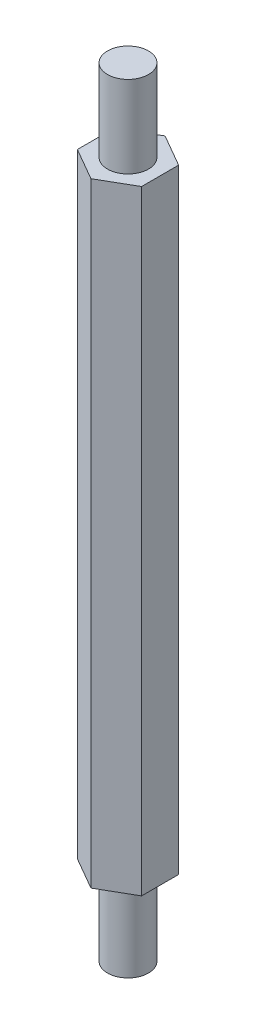
ISO-10303-21;
HEADER;
FILE_DESCRIPTION(('STEP AP214'),'2;1');
FILE_NAME('part.step','',(''),(''),'','','');
FILE_SCHEMA(('AUTOMOTIVE_DESIGN { 1 0 10303 214 1 1 1 1 }'));
ENDSEC;
DATA;
#1=APPLICATION_CONTEXT('core data for automotive mechanical design processes');
#2=APPLICATION_PROTOCOL_DEFINITION('international standard','automotive_design',2000,#1);
#3=PRODUCT_CONTEXT('',#1,'mechanical');
#4=PRODUCT('Part','Part','',(#3));
#5=PRODUCT_RELATED_PRODUCT_CATEGORY('part','',(#4));
#6=PRODUCT_DEFINITION_FORMATION('','',#4);
#7=PRODUCT_DEFINITION_CONTEXT('part definition',#1,'design');
#8=PRODUCT_DEFINITION('design','',#6,#7);
#9=PRODUCT_DEFINITION_SHAPE('','',#8);
#10=(LENGTH_UNIT() NAMED_UNIT(*) SI_UNIT(.MILLI.,.METRE.));
#11=(NAMED_UNIT(*) PLANE_ANGLE_UNIT() SI_UNIT($,.RADIAN.));
#12=(NAMED_UNIT(*) SI_UNIT($,.STERADIAN.) SOLID_ANGLE_UNIT());
#13=UNCERTAINTY_MEASURE_WITH_UNIT(LENGTH_MEASURE(1.E-05),#10,'distance_accuracy_value','');
#14=(GEOMETRIC_REPRESENTATION_CONTEXT(3) GLOBAL_UNCERTAINTY_ASSIGNED_CONTEXT((#13)) GLOBAL_UNIT_ASSIGNED_CONTEXT((#10,
#11,#12)) REPRESENTATION_CONTEXT('',''));
#15=CARTESIAN_POINT('',(0.,0.,0.));
#16=DIRECTION('',(0.,0.,1.));
#17=DIRECTION('',(1.,0.,0.));
#18=AXIS2_PLACEMENT_3D('',#15,#16,#17);
#19=CARTESIAN_POINT('',(2.34999999999999,45.,-1.35677313259565));
#20=DIRECTION('',(-0.499999999999995,0.,0.866025403784441));
#21=DIRECTION('',(0.866025403784441,0.,0.499999999999995));
#22=AXIS2_PLACEMENT_3D('',#19,#20,#21);
#23=PLANE('',#22);
#24=DIRECTION('',(-0.866025403784441,0.,-0.499999999999995));
#25=VECTOR('',#24,1.);
#26=CARTESIAN_POINT('',(2.34999999999999,0.,-1.35677313259565));
#27=LINE('',#26,#25);
#28=CARTESIAN_POINT('',(2.34999999999999,0.,-1.35677313259565));
#29=VERTEX_POINT('',#28);
#30=CARTESIAN_POINT('',(0.,0.,-2.71354626519124));
#31=VERTEX_POINT('',#30);
#32=EDGE_CURVE('E131',#29,#31,#27,.T.);
#33=ORIENTED_EDGE('',*,*,#32,.T.);
#34=DIRECTION('',(0.,-1.,0.));
#35=VECTOR('',#34,1.);
#36=CARTESIAN_POINT('',(0.,45.,-2.71354626519124));
#37=LINE('',#36,#35);
#38=CARTESIAN_POINT('',(0.,45.,-2.71354626519124));
#39=VERTEX_POINT('',#38);
#40=EDGE_CURVE('E42',#39,#31,#37,.T.);
#41=ORIENTED_EDGE('',*,*,#40,.F.);
#42=DIRECTION('',(-0.866025403784441,0.,-0.499999999999995));
#43=VECTOR('',#42,1.);
#44=CARTESIAN_POINT('',(2.34999999999999,45.,-1.35677313259565));
#45=LINE('',#44,#43);
#46=CARTESIAN_POINT('',(2.34999999999999,45.,-1.35677313259565));
#47=VERTEX_POINT('',#46);
#48=EDGE_CURVE('E148',#47,#39,#45,.T.);
#49=ORIENTED_EDGE('',*,*,#48,.F.);
#50=DIRECTION('',(0.,-1.,0.));
#51=VECTOR('',#50,1.);
#52=CARTESIAN_POINT('',(2.34999999999999,45.,-1.35677313259565));
#53=LINE('',#52,#51);
#54=EDGE_CURVE('E127',#47,#29,#53,.T.);
#55=ORIENTED_EDGE('',*,*,#54,.T.);
#56=EDGE_LOOP('',(#33,#41,#49,#55));
#57=FACE_BOUND('',#56,.T.);
#58=ADVANCED_FACE('F39',(#57),#23,.F.);
#59=CARTESIAN_POINT('',(0.,45.,-2.71354626519124));
#60=DIRECTION('',(0.500000000000001,0.,0.866025403784438));
#61=DIRECTION('',(0.866025403784438,0.,-0.500000000000001));
#62=AXIS2_PLACEMENT_3D('',#59,#60,#61);
#63=PLANE('',#62);
#64=DIRECTION('',(-0.866025403784438,0.,0.500000000000001));
#65=VECTOR('',#64,1.);
#66=CARTESIAN_POINT('',(0.,0.,-2.71354626519124));
#67=LINE('',#66,#65);
#68=CARTESIAN_POINT('',(-2.35,0.,-1.35677313259562));
#69=VERTEX_POINT('',#68);
#70=EDGE_CURVE('E135',#31,#69,#67,.T.);
#71=ORIENTED_EDGE('',*,*,#70,.T.);
#72=DIRECTION('',(0.,-1.,0.));
#73=VECTOR('',#72,1.);
#74=CARTESIAN_POINT('',(-2.35,45.,-1.35677313259562));
#75=LINE('',#74,#73);
#76=CARTESIAN_POINT('',(-2.35,45.,-1.35677313259562));
#77=VERTEX_POINT('',#76);
#78=EDGE_CURVE('E154',#77,#69,#75,.T.);
#79=ORIENTED_EDGE('',*,*,#78,.F.);
#80=DIRECTION('',(-0.866025403784438,0.,0.500000000000001));
#81=VECTOR('',#80,1.);
#82=CARTESIAN_POINT('',(0.,45.,-2.71354626519124));
#83=LINE('',#82,#81);
#84=EDGE_CURVE('E96',#39,#77,#83,.T.);
#85=ORIENTED_EDGE('',*,*,#84,.F.);
#86=ORIENTED_EDGE('',*,*,#40,.T.);
#87=EDGE_LOOP('',(#71,#79,#85,#86));
#88=FACE_BOUND('',#87,.T.);
#89=ADVANCED_FACE('F208',(#88),#63,.F.);
#90=CARTESIAN_POINT('',(-2.35,45.,-1.35677313259562));
#91=DIRECTION('',(1.,0.,0.));
#92=DIRECTION('',(0.,0.,-1.));
#93=AXIS2_PLACEMENT_3D('',#90,#91,#92);
#94=PLANE('',#93);
#95=DIRECTION('',(0.,0.,1.));
#96=VECTOR('',#95,1.);
#97=CARTESIAN_POINT('',(-2.35,0.,-1.35677313259562));
#98=LINE('',#97,#96);
#99=CARTESIAN_POINT('',(-2.35,0.,1.35677313259563));
#100=VERTEX_POINT('',#99);
#101=EDGE_CURVE('E139',#69,#100,#98,.T.);
#102=ORIENTED_EDGE('',*,*,#101,.T.);
#103=DIRECTION('',(0.,-1.,0.));
#104=VECTOR('',#103,1.);
#105=CARTESIAN_POINT('',(-2.35,45.,1.35677313259563));
#106=LINE('',#105,#104);
#107=CARTESIAN_POINT('',(-2.35,45.,1.35677313259563));
#108=VERTEX_POINT('',#107);
#109=EDGE_CURVE('E120',#108,#100,#106,.T.);
#110=ORIENTED_EDGE('',*,*,#109,.F.);
#111=DIRECTION('',(0.,0.,1.));
#112=VECTOR('',#111,1.);
#113=CARTESIAN_POINT('',(-2.35,45.,-1.35677313259562));
#114=LINE('',#113,#112);
#115=EDGE_CURVE('E109',#77,#108,#114,.T.);
#116=ORIENTED_EDGE('',*,*,#115,.F.);
#117=ORIENTED_EDGE('',*,*,#78,.T.);
#118=EDGE_LOOP('',(#102,#110,#116,#117));
#119=FACE_BOUND('',#118,.T.);
#120=ADVANCED_FACE('F212',(#119),#94,.F.);
#121=CARTESIAN_POINT('',(-2.35,45.,1.35677313259563));
#122=DIRECTION('',(0.499999999999995,0.,-0.866025403784442));
#123=DIRECTION('',(-0.866025403784442,0.,-0.499999999999995));
#124=AXIS2_PLACEMENT_3D('',#121,#122,#123);
#125=PLANE('',#124);
#126=DIRECTION('',(0.866025403784442,0.,0.499999999999995));
#127=VECTOR('',#126,1.);
#128=CARTESIAN_POINT('',(-2.35,0.,1.35677313259563));
#129=LINE('',#128,#127);
#130=CARTESIAN_POINT('',(0.,0.,2.71354626519124));
#131=VERTEX_POINT('',#130);
#132=EDGE_CURVE('E118',#100,#131,#129,.T.);
#133=ORIENTED_EDGE('',*,*,#132,.T.);
#134=DIRECTION('',(0.,-1.,0.));
#135=VECTOR('',#134,1.);
#136=CARTESIAN_POINT('',(0.,45.,2.71354626519124));
#137=LINE('',#136,#135);
#138=CARTESIAN_POINT('',(0.,45.,2.71354626519124));
#139=VERTEX_POINT('',#138);
#140=EDGE_CURVE('E115',#139,#131,#137,.T.);
#141=ORIENTED_EDGE('',*,*,#140,.F.);
#142=DIRECTION('',(0.866025403784442,0.,0.499999999999995));
#143=VECTOR('',#142,1.);
#144=CARTESIAN_POINT('',(-2.35,45.,1.35677313259563));
#145=LINE('',#144,#143);
#146=EDGE_CURVE('E103',#108,#139,#145,.T.);
#147=ORIENTED_EDGE('',*,*,#146,.F.);
#148=ORIENTED_EDGE('',*,*,#109,.T.);
#149=EDGE_LOOP('',(#133,#141,#147,#148));
#150=FACE_BOUND('',#149,.T.);
#151=ADVANCED_FACE('F116',(#150),#125,.F.);
#152=CARTESIAN_POINT('',(0.,45.,2.71354626519124));
#153=DIRECTION('',(-0.500000000000007,0.,-0.866025403784434));
#154=DIRECTION('',(-0.866025403784435,0.,0.500000000000007));
#155=AXIS2_PLACEMENT_3D('',#152,#153,#154);
#156=PLANE('',#155);
#157=DIRECTION('',(0.866025403784435,0.,-0.500000000000007));
#158=VECTOR('',#157,1.);
#159=CARTESIAN_POINT('',(0.,0.,2.71354626519124));
#160=LINE('',#159,#158);
#161=CARTESIAN_POINT('',(2.35000000000001,0.,1.3567731325956));
#162=VERTEX_POINT('',#161);
#163=EDGE_CURVE('E81',#131,#162,#160,.T.);
#164=ORIENTED_EDGE('',*,*,#163,.T.);
#165=DIRECTION('',(0.,-1.,0.));
#166=VECTOR('',#165,1.);
#167=CARTESIAN_POINT('',(2.35000000000001,45.,1.3567731325956));
#168=LINE('',#167,#166);
#169=CARTESIAN_POINT('',(2.35000000000001,45.,1.3567731325956));
#170=VERTEX_POINT('',#169);
#171=EDGE_CURVE('E121',#170,#162,#168,.T.);
#172=ORIENTED_EDGE('',*,*,#171,.F.);
#173=DIRECTION('',(0.866025403784435,0.,-0.500000000000007));
#174=VECTOR('',#173,1.);
#175=CARTESIAN_POINT('',(0.,45.,2.71354626519124));
#176=LINE('',#175,#174);
#177=EDGE_CURVE('E107',#139,#170,#176,.T.);
#178=ORIENTED_EDGE('',*,*,#177,.F.);
#179=ORIENTED_EDGE('',*,*,#140,.T.);
#180=EDGE_LOOP('',(#164,#172,#178,#179));
#181=FACE_BOUND('',#180,.T.);
#182=ADVANCED_FACE('F123',(#181),#156,.F.);
#183=CARTESIAN_POINT('',(2.35000000000001,45.,1.3567731325956));
#184=DIRECTION('',(-1.,0.,0.));
#185=DIRECTION('',(0.,0.,1.));
#186=AXIS2_PLACEMENT_3D('',#183,#184,#185);
#187=PLANE('',#186);
#188=DIRECTION('',(0.,0.,-1.));
#189=VECTOR('',#188,1.);
#190=CARTESIAN_POINT('',(2.35000000000001,0.,1.3567731325956));
#191=LINE('',#190,#189);
#192=EDGE_CURVE('E87',#162,#29,#191,.T.);
#193=ORIENTED_EDGE('',*,*,#192,.T.);
#194=ORIENTED_EDGE('',*,*,#54,.F.);
#195=DIRECTION('',(0.,0.,-1.));
#196=VECTOR('',#195,1.);
#197=CARTESIAN_POINT('',(2.35000000000001,45.,1.3567731325956));
#198=LINE('',#197,#196);
#199=EDGE_CURVE('E58',#170,#47,#198,.T.);
#200=ORIENTED_EDGE('',*,*,#199,.F.);
#201=ORIENTED_EDGE('',*,*,#171,.T.);
#202=EDGE_LOOP('',(#193,#194,#200,#201));
#203=FACE_BOUND('',#202,.T.);
#204=ADVANCED_FACE('F197',(#203),#187,.F.);
#205=CARTESIAN_POINT('',(0.,45.,0.));
#206=DIRECTION('',(0.,1.,0.));
#207=DIRECTION('',(0.,0.,1.));
#208=AXIS2_PLACEMENT_3D('',#205,#206,#207);
#209=PLANE('',#208);
#210=CARTESIAN_POINT('',(0.,45.,0.));
#211=DIRECTION('',(0.,1.,0.));
#212=DIRECTION('',(0.,0.,1.));
#213=AXIS2_PLACEMENT_3D('',#210,#211,#212);
#214=CIRCLE('',#213,1.5);
#215=CARTESIAN_POINT('',(0.,45.,1.5));
#216=VERTEX_POINT('',#215);
#217=EDGE_CURVE('E49',#216,#216,#214,.T.);
#218=ORIENTED_EDGE('',*,*,#217,.F.);
#219=EDGE_LOOP('',(#218));
#220=FACE_BOUND('',#219,.T.);
#221=ORIENTED_EDGE('',*,*,#48,.T.);
#222=ORIENTED_EDGE('',*,*,#84,.T.);
#223=ORIENTED_EDGE('',*,*,#115,.T.);
#224=ORIENTED_EDGE('',*,*,#146,.T.);
#225=ORIENTED_EDGE('',*,*,#177,.T.);
#226=ORIENTED_EDGE('',*,*,#199,.T.);
#227=EDGE_LOOP('',(#221,#222,#223,#224,#225,#226));
#228=FACE_BOUND('',#227,.T.);
#229=ADVANCED_FACE('F105',(#220,#228),#209,.T.);
#230=CARTESIAN_POINT('',(0.,0.,0.));
#231=DIRECTION('',(0.,1.,0.));
#232=DIRECTION('',(0.,0.,1.));
#233=AXIS2_PLACEMENT_3D('',#230,#231,#232);
#234=PLANE('',#233);
#235=CARTESIAN_POINT('',(0.,0.,0.));
#236=DIRECTION('',(0.,-1.,0.));
#237=DIRECTION('',(0.,0.,-1.));
#238=AXIS2_PLACEMENT_3D('',#235,#236,#237);
#239=CIRCLE('',#238,1.5);
#240=CARTESIAN_POINT('',(0.,0.,-1.5));
#241=VERTEX_POINT('',#240);
#242=EDGE_CURVE('E11',#241,#241,#239,.T.);
#243=ORIENTED_EDGE('',*,*,#242,.F.);
#244=EDGE_LOOP('',(#243));
#245=FACE_BOUND('',#244,.T.);
#246=ORIENTED_EDGE('',*,*,#32,.F.);
#247=ORIENTED_EDGE('',*,*,#192,.F.);
#248=ORIENTED_EDGE('',*,*,#163,.F.);
#249=ORIENTED_EDGE('',*,*,#132,.F.);
#250=ORIENTED_EDGE('',*,*,#101,.F.);
#251=ORIENTED_EDGE('',*,*,#70,.F.);
#252=EDGE_LOOP('',(#246,#247,#248,#249,#250,#251));
#253=FACE_BOUND('',#252,.T.);
#254=ADVANCED_FACE('F189',(#245,#253),#234,.F.);
#255=CARTESIAN_POINT('',(0.,51.,0.));
#256=DIRECTION('',(0.,-1.,0.));
#257=DIRECTION('',(0.,0.,-1.));
#258=AXIS2_PLACEMENT_3D('',#255,#256,#257);
#259=CYLINDRICAL_SURFACE('',#258,1.5);
#260=CARTESIAN_POINT('',(0.,51.,0.));
#261=DIRECTION('',(0.,1.,0.));
#262=DIRECTION('',(0.,0.,1.));
#263=AXIS2_PLACEMENT_3D('',#260,#261,#262);
#264=CIRCLE('',#263,1.5);
#265=CARTESIAN_POINT('',(0.,51.,1.5));
#266=VERTEX_POINT('',#265);
#267=EDGE_CURVE('E136',#266,#266,#264,.T.);
#268=ORIENTED_EDGE('',*,*,#267,.F.);
#269=EDGE_LOOP('',(#268));
#270=FACE_BOUND('',#269,.T.);
#271=ORIENTED_EDGE('',*,*,#217,.T.);
#272=EDGE_LOOP('',(#271));
#273=FACE_BOUND('',#272,.T.);
#274=ADVANCED_FACE('F192',(#270,#273),#259,.T.);
#275=CARTESIAN_POINT('',(0.,51.,0.));
#276=DIRECTION('',(0.,1.,0.));
#277=DIRECTION('',(0.,0.,1.));
#278=AXIS2_PLACEMENT_3D('',#275,#276,#277);
#279=PLANE('',#278);
#280=ORIENTED_EDGE('',*,*,#267,.T.);
#281=EDGE_LOOP('',(#280));
#282=FACE_BOUND('',#281,.T.);
#283=ADVANCED_FACE('F185',(#282),#279,.T.);
#284=CARTESIAN_POINT('',(0.,-6.,0.));
#285=DIRECTION('',(0.,1.,0.));
#286=DIRECTION('',(0.,0.,1.));
#287=AXIS2_PLACEMENT_3D('',#284,#285,#286);
#288=CYLINDRICAL_SURFACE('',#287,1.5);
#289=CARTESIAN_POINT('',(0.,-6.,0.));
#290=DIRECTION('',(0.,-1.,0.));
#291=DIRECTION('',(0.,0.,-1.));
#292=AXIS2_PLACEMENT_3D('',#289,#290,#291);
#293=CIRCLE('',#292,1.5);
#294=CARTESIAN_POINT('',(0.,-6.,-1.5));
#295=VERTEX_POINT('',#294);
#296=EDGE_CURVE('E175',#295,#295,#293,.T.);
#297=ORIENTED_EDGE('',*,*,#296,.F.);
#298=EDGE_LOOP('',(#297));
#299=FACE_BOUND('',#298,.T.);
#300=ORIENTED_EDGE('',*,*,#242,.T.);
#301=EDGE_LOOP('',(#300));
#302=FACE_BOUND('',#301,.T.);
#303=ADVANCED_FACE('F182',(#299,#302),#288,.T.);
#304=CARTESIAN_POINT('',(0.,-6.,0.));
#305=DIRECTION('',(0.,-1.,0.));
#306=DIRECTION('',(0.,0.,-1.));
#307=AXIS2_PLACEMENT_3D('',#304,#305,#306);
#308=PLANE('',#307);
#309=ORIENTED_EDGE('',*,*,#296,.T.);
#310=EDGE_LOOP('',(#309));
#311=FACE_BOUND('',#310,.T.);
#312=ADVANCED_FACE('F180',(#311),#308,.T.);
#313=CLOSED_SHELL('',(#58,#89,#120,#151,#182,#204,#229,#254,#274,#283,#303,#312));
#314=MANIFOLD_SOLID_BREP('B2',#313);
#315=ADVANCED_BREP_SHAPE_REPRESENTATION('',(#18,#314),#14);
#316=SHAPE_DEFINITION_REPRESENTATION(#9,#315);
ENDSEC;
END-ISO-10303-21;
